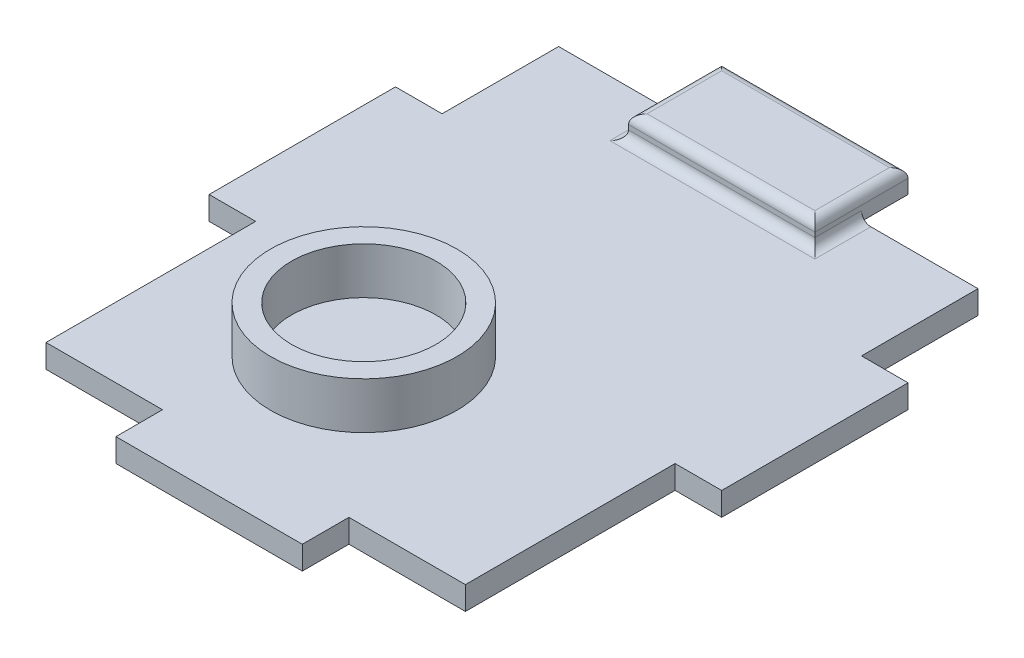
ISO-10303-21;
HEADER;
FILE_DESCRIPTION(('STEP AP214'),'2;1');
FILE_NAME('part.step','',(''),(''),'','','');
FILE_SCHEMA(('AUTOMOTIVE_DESIGN { 1 0 10303 214 1 1 1 1 }'));
ENDSEC;
DATA;
#1=APPLICATION_CONTEXT('core data for automotive mechanical design processes');
#2=APPLICATION_PROTOCOL_DEFINITION('international standard','automotive_design',2000,#1);
#3=PRODUCT_CONTEXT('',#1,'mechanical');
#4=PRODUCT('Part','Part','',(#3));
#5=PRODUCT_RELATED_PRODUCT_CATEGORY('part','',(#4));
#6=PRODUCT_DEFINITION_FORMATION('','',#4);
#7=PRODUCT_DEFINITION_CONTEXT('part definition',#1,'design');
#8=PRODUCT_DEFINITION('design','',#6,#7);
#9=PRODUCT_DEFINITION_SHAPE('','',#8);
#10=(LENGTH_UNIT() NAMED_UNIT(*) SI_UNIT(.MILLI.,.METRE.));
#11=(NAMED_UNIT(*) PLANE_ANGLE_UNIT() SI_UNIT($,.RADIAN.));
#12=(NAMED_UNIT(*) SI_UNIT($,.STERADIAN.) SOLID_ANGLE_UNIT());
#13=UNCERTAINTY_MEASURE_WITH_UNIT(LENGTH_MEASURE(1.E-05),#10,'distance_accuracy_value','');
#14=(GEOMETRIC_REPRESENTATION_CONTEXT(3) GLOBAL_UNCERTAINTY_ASSIGNED_CONTEXT((#13)) GLOBAL_UNIT_ASSIGNED_CONTEXT((#10,
#11,#12)) REPRESENTATION_CONTEXT('',''));
#15=CARTESIAN_POINT('',(0.,0.,0.));
#16=DIRECTION('',(0.,0.,1.));
#17=DIRECTION('',(1.,0.,0.));
#18=AXIS2_PLACEMENT_3D('',#15,#16,#17);
#19=CARTESIAN_POINT('',(0.,5.,0.));
#20=DIRECTION('',(0.,1.,0.));
#21=DIRECTION('',(0.,0.,1.));
#22=AXIS2_PLACEMENT_3D('',#19,#20,#21);
#23=PLANE('',#22);
#24=CARTESIAN_POINT('',(36.72,5.,-31.47));
#25=DIRECTION('',(0.,1.,0.));
#26=DIRECTION('',(0.,0.,1.));
#27=AXIS2_PLACEMENT_3D('',#24,#25,#26);
#28=CIRCLE('',#27,20.);
#29=CARTESIAN_POINT('',(36.72,5.,-11.47));
#30=VERTEX_POINT('',#29);
#31=EDGE_CURVE('E244',#30,#30,#28,.T.);
#32=ORIENTED_EDGE('',*,*,#31,.F.);
#33=EDGE_LOOP('',(#32));
#34=FACE_BOUND('',#33,.T.);
#35=DIRECTION('',(1.,0.,0.));
#36=VECTOR('',#35,1.);
#37=CARTESIAN_POINT('',(0.,5.,-98.));
#38=LINE('',#37,#36);
#39=CARTESIAN_POINT('',(67.,5.,-98.));
#40=VERTEX_POINT('',#39);
#41=CARTESIAN_POINT('',(23.,5.,-98.));
#42=VERTEX_POINT('',#41);
#43=EDGE_CURVE('E60',#40,#42,#38,.F.);
#44=ORIENTED_EDGE('',*,*,#43,.T.);
#45=DIRECTION('',(0.,0.,-1.));
#46=VECTOR('',#45,1.);
#47=CARTESIAN_POINT('',(23.,5.,0.));
#48=LINE('',#47,#46);
#49=CARTESIAN_POINT('',(23.,5.,-110.));
#50=VERTEX_POINT('',#49);
#51=EDGE_CURVE('E398',#42,#50,#48,.T.);
#52=ORIENTED_EDGE('',*,*,#51,.T.);
#53=DIRECTION('',(1.,0.,0.));
#54=VECTOR('',#53,1.);
#55=CARTESIAN_POINT('',(0.,5.,-110.));
#56=LINE('',#55,#54);
#57=CARTESIAN_POINT('',(0.,5.,-110.));
#58=VERTEX_POINT('',#57);
#59=EDGE_CURVE('E278',#58,#50,#56,.T.);
#60=ORIENTED_EDGE('',*,*,#59,.F.);
#61=DIRECTION('',(0.,0.,-1.));
#62=VECTOR('',#61,1.);
#63=CARTESIAN_POINT('',(0.,5.,0.));
#64=LINE('',#63,#62);
#65=CARTESIAN_POINT('',(0.,5.,-85.));
#66=VERTEX_POINT('',#65);
#67=EDGE_CURVE('E281',#66,#58,#64,.T.);
#68=ORIENTED_EDGE('',*,*,#67,.F.);
#69=DIRECTION('',(-1.,0.,0.));
#70=VECTOR('',#69,1.);
#71=CARTESIAN_POINT('',(1.17961196366423E-13,5.,-85.));
#72=LINE('',#71,#70);
#73=CARTESIAN_POINT('',(-9.99999999999999,5.,-85.));
#74=VERTEX_POINT('',#73);
#75=EDGE_CURVE('E286',#66,#74,#72,.T.);
#76=ORIENTED_EDGE('',*,*,#75,.T.);
#77=DIRECTION('',(0.,0.,1.));
#78=VECTOR('',#77,1.);
#79=CARTESIAN_POINT('',(-9.99999999999999,5.,0.));
#80=LINE('',#79,#78);
#81=CARTESIAN_POINT('',(-9.99999999999999,5.,-45.));
#82=VERTEX_POINT('',#81);
#83=EDGE_CURVE('E289',#74,#82,#80,.T.);
#84=ORIENTED_EDGE('',*,*,#83,.T.);
#85=DIRECTION('',(-1.,0.,0.));
#86=VECTOR('',#85,1.);
#87=CARTESIAN_POINT('',(0.,5.,-45.));
#88=LINE('',#87,#86);
#89=CARTESIAN_POINT('',(0.,5.,-45.));
#90=VERTEX_POINT('',#89);
#91=EDGE_CURVE('E291',#90,#82,#88,.T.);
#92=ORIENTED_EDGE('',*,*,#91,.F.);
#93=CARTESIAN_POINT('',(0.,5.,0.));
#94=VERTEX_POINT('',#93);
#95=EDGE_CURVE('E287',#94,#90,#64,.T.);
#96=ORIENTED_EDGE('',*,*,#95,.F.);
#97=DIRECTION('',(1.,0.,0.));
#98=VECTOR('',#97,1.);
#99=CARTESIAN_POINT('',(0.,5.,0.));
#100=LINE('',#99,#98);
#101=CARTESIAN_POINT('',(25.,5.,0.));
#102=VERTEX_POINT('',#101);
#103=EDGE_CURVE('E254',#94,#102,#100,.T.);
#104=ORIENTED_EDGE('',*,*,#103,.T.);
#105=DIRECTION('',(0.,0.,1.));
#106=VECTOR('',#105,1.);
#107=CARTESIAN_POINT('',(25.,5.,0.));
#108=LINE('',#107,#106);
#109=CARTESIAN_POINT('',(25.,5.,10.));
#110=VERTEX_POINT('',#109);
#111=EDGE_CURVE('E257',#102,#110,#108,.T.);
#112=ORIENTED_EDGE('',*,*,#111,.T.);
#113=DIRECTION('',(-1.,0.,0.));
#114=VECTOR('',#113,1.);
#115=CARTESIAN_POINT('',(0.,5.,10.));
#116=LINE('',#115,#114);
#117=CARTESIAN_POINT('',(65.,5.,10.));
#118=VERTEX_POINT('',#117);
#119=EDGE_CURVE('E261',#118,#110,#116,.T.);
#120=ORIENTED_EDGE('',*,*,#119,.F.);
#121=DIRECTION('',(0.,0.,1.));
#122=VECTOR('',#121,1.);
#123=CARTESIAN_POINT('',(65.,5.,0.));
#124=LINE('',#123,#122);
#125=CARTESIAN_POINT('',(65.,5.,0.));
#126=VERTEX_POINT('',#125);
#127=EDGE_CURVE('E264',#126,#118,#124,.T.);
#128=ORIENTED_EDGE('',*,*,#127,.F.);
#129=CARTESIAN_POINT('',(90.,5.,0.));
#130=VERTEX_POINT('',#129);
#131=EDGE_CURVE('E259',#126,#130,#100,.T.);
#132=ORIENTED_EDGE('',*,*,#131,.T.);
#133=DIRECTION('',(0.,0.,-1.));
#134=VECTOR('',#133,1.);
#135=CARTESIAN_POINT('',(90.,5.,0.));
#136=LINE('',#135,#134);
#137=CARTESIAN_POINT('',(90.,5.,-45.));
#138=VERTEX_POINT('',#137);
#139=EDGE_CURVE('E267',#130,#138,#136,.T.);
#140=ORIENTED_EDGE('',*,*,#139,.T.);
#141=DIRECTION('',(1.,0.,0.));
#142=VECTOR('',#141,1.);
#143=CARTESIAN_POINT('',(0.,5.,-45.));
#144=LINE('',#143,#142);
#145=CARTESIAN_POINT('',(100.,5.,-45.));
#146=VERTEX_POINT('',#145);
#147=EDGE_CURVE('E269',#138,#146,#144,.T.);
#148=ORIENTED_EDGE('',*,*,#147,.T.);
#149=DIRECTION('',(0.,0.,1.));
#150=VECTOR('',#149,1.);
#151=CARTESIAN_POINT('',(100.,5.,0.));
#152=LINE('',#151,#150);
#153=CARTESIAN_POINT('',(100.,5.,-85.));
#154=VERTEX_POINT('',#153);
#155=EDGE_CURVE('E272',#154,#146,#152,.T.);
#156=ORIENTED_EDGE('',*,*,#155,.F.);
#157=DIRECTION('',(1.,0.,0.));
#158=VECTOR('',#157,1.);
#159=CARTESIAN_POINT('',(1.17961196366423E-13,5.,-85.0000000000001));
#160=LINE('',#159,#158);
#161=CARTESIAN_POINT('',(90.,5.,-85.));
#162=VERTEX_POINT('',#161);
#163=EDGE_CURVE('E275',#162,#154,#160,.T.);
#164=ORIENTED_EDGE('',*,*,#163,.F.);
#165=CARTESIAN_POINT('',(90.,5.,-110.));
#166=VERTEX_POINT('',#165);
#167=EDGE_CURVE('E270',#162,#166,#136,.T.);
#168=ORIENTED_EDGE('',*,*,#167,.T.);
#169=CARTESIAN_POINT('',(67.,5.,-110.));
#170=VERTEX_POINT('',#169);
#171=EDGE_CURVE('E283',#170,#166,#56,.T.);
#172=ORIENTED_EDGE('',*,*,#171,.F.);
#173=DIRECTION('',(0.,0.,-1.));
#174=VECTOR('',#173,1.);
#175=CARTESIAN_POINT('',(66.9999999999999,5.,0.));
#176=LINE('',#175,#174);
#177=EDGE_CURVE('E396',#170,#40,#176,.F.);
#178=ORIENTED_EDGE('',*,*,#177,.T.);
#179=EDGE_LOOP('',(#44,#52,#60,#68,#76,#84,#92,#96,#104,#112,#120,#128,#132,#140,#148,#156,#164,
#168,#172,#178));
#180=FACE_BOUND('',#179,.T.);
#181=ADVANCED_FACE('F35',(#34,#180),#23,.T.);
#182=CARTESIAN_POINT('',(0.,5.,0.));
#183=DIRECTION('',(0.,0.,-1.));
#184=DIRECTION('',(-1.,0.,0.));
#185=AXIS2_PLACEMENT_3D('',#182,#183,#184);
#186=PLANE('',#185);
#187=DIRECTION('',(1.,0.,0.));
#188=VECTOR('',#187,1.);
#189=CARTESIAN_POINT('',(0.,0.,0.));
#190=LINE('',#189,#188);
#191=CARTESIAN_POINT('',(0.,0.,0.));
#192=VERTEX_POINT('',#191);
#193=CARTESIAN_POINT('',(25.,0.,0.));
#194=VERTEX_POINT('',#193);
#195=EDGE_CURVE('E251',#192,#194,#190,.T.);
#196=ORIENTED_EDGE('',*,*,#195,.T.);
#197=DIRECTION('',(0.,-1.,0.));
#198=VECTOR('',#197,1.);
#199=CARTESIAN_POINT('',(25.,5.,0.));
#200=LINE('',#199,#198);
#201=EDGE_CURVE('E365',#102,#194,#200,.T.);
#202=ORIENTED_EDGE('',*,*,#201,.F.);
#203=ORIENTED_EDGE('',*,*,#103,.F.);
#204=DIRECTION('',(0.,-1.,0.));
#205=VECTOR('',#204,1.);
#206=CARTESIAN_POINT('',(0.,5.,0.));
#207=LINE('',#206,#205);
#208=EDGE_CURVE('E332',#94,#192,#207,.T.);
#209=ORIENTED_EDGE('',*,*,#208,.T.);
#210=EDGE_LOOP('',(#196,#202,#203,#209));
#211=FACE_BOUND('',#210,.T.);
#212=ADVANCED_FACE('F460',(#211),#186,.F.);
#213=CARTESIAN_POINT('',(25.,5.,0.));
#214=DIRECTION('',(1.,0.,0.));
#215=DIRECTION('',(0.,0.,-1.));
#216=AXIS2_PLACEMENT_3D('',#213,#214,#215);
#217=PLANE('',#216);
#218=DIRECTION('',(0.,0.,1.));
#219=VECTOR('',#218,1.);
#220=CARTESIAN_POINT('',(25.,0.,0.));
#221=LINE('',#220,#219);
#222=CARTESIAN_POINT('',(25.,0.,10.));
#223=VERTEX_POINT('',#222);
#224=EDGE_CURVE('E296',#194,#223,#221,.T.);
#225=ORIENTED_EDGE('',*,*,#224,.T.);
#226=DIRECTION('',(0.,-1.,0.));
#227=VECTOR('',#226,1.);
#228=CARTESIAN_POINT('',(25.,5.,10.));
#229=LINE('',#228,#227);
#230=EDGE_CURVE('E363',#110,#223,#229,.T.);
#231=ORIENTED_EDGE('',*,*,#230,.F.);
#232=ORIENTED_EDGE('',*,*,#111,.F.);
#233=ORIENTED_EDGE('',*,*,#201,.T.);
#234=EDGE_LOOP('',(#225,#231,#232,#233));
#235=FACE_BOUND('',#234,.T.);
#236=ADVANCED_FACE('F467',(#235),#217,.F.);
#237=CARTESIAN_POINT('',(0.,5.,10.));
#238=DIRECTION('',(0.,0.,1.));
#239=DIRECTION('',(1.,0.,0.));
#240=AXIS2_PLACEMENT_3D('',#237,#238,#239);
#241=PLANE('',#240);
#242=DIRECTION('',(-1.,0.,0.));
#243=VECTOR('',#242,1.);
#244=CARTESIAN_POINT('',(0.,0.,10.));
#245=LINE('',#244,#243);
#246=CARTESIAN_POINT('',(65.,0.,10.));
#247=VERTEX_POINT('',#246);
#248=EDGE_CURVE('E300',#247,#223,#245,.T.);
#249=ORIENTED_EDGE('',*,*,#248,.F.);
#250=DIRECTION('',(0.,-1.,0.));
#251=VECTOR('',#250,1.);
#252=CARTESIAN_POINT('',(65.,5.,10.));
#253=LINE('',#252,#251);
#254=EDGE_CURVE('E361',#118,#247,#253,.T.);
#255=ORIENTED_EDGE('',*,*,#254,.F.);
#256=ORIENTED_EDGE('',*,*,#119,.T.);
#257=ORIENTED_EDGE('',*,*,#230,.T.);
#258=EDGE_LOOP('',(#249,#255,#256,#257));
#259=FACE_BOUND('',#258,.T.);
#260=ADVANCED_FACE('F737',(#259),#241,.T.);
#261=CARTESIAN_POINT('',(65.,5.,0.));
#262=DIRECTION('',(1.,0.,0.));
#263=DIRECTION('',(0.,0.,-1.));
#264=AXIS2_PLACEMENT_3D('',#261,#262,#263);
#265=PLANE('',#264);
#266=DIRECTION('',(0.,0.,1.));
#267=VECTOR('',#266,1.);
#268=CARTESIAN_POINT('',(65.,0.,0.));
#269=LINE('',#268,#267);
#270=CARTESIAN_POINT('',(65.,0.,0.));
#271=VERTEX_POINT('',#270);
#272=EDGE_CURVE('E303',#271,#247,#269,.T.);
#273=ORIENTED_EDGE('',*,*,#272,.F.);
#274=DIRECTION('',(0.,-1.,0.));
#275=VECTOR('',#274,1.);
#276=CARTESIAN_POINT('',(65.,5.,0.));
#277=LINE('',#276,#275);
#278=EDGE_CURVE('E359',#126,#271,#277,.T.);
#279=ORIENTED_EDGE('',*,*,#278,.F.);
#280=ORIENTED_EDGE('',*,*,#127,.T.);
#281=ORIENTED_EDGE('',*,*,#254,.T.);
#282=EDGE_LOOP('',(#273,#279,#280,#281));
#283=FACE_BOUND('',#282,.T.);
#284=ADVANCED_FACE('F733',(#283),#265,.T.);
#285=CARTESIAN_POINT('',(90.,0.,0.));
#286=VERTEX_POINT('',#285);
#287=EDGE_CURVE('E297',#271,#286,#190,.T.);
#288=ORIENTED_EDGE('',*,*,#287,.T.);
#289=DIRECTION('',(0.,-1.,0.));
#290=VECTOR('',#289,1.);
#291=CARTESIAN_POINT('',(90.,5.,0.));
#292=LINE('',#291,#290);
#293=EDGE_CURVE('E356',#130,#286,#292,.T.);
#294=ORIENTED_EDGE('',*,*,#293,.F.);
#295=ORIENTED_EDGE('',*,*,#131,.F.);
#296=ORIENTED_EDGE('',*,*,#278,.T.);
#297=EDGE_LOOP('',(#288,#294,#295,#296));
#298=FACE_BOUND('',#297,.T.);
#299=ADVANCED_FACE('F470',(#298),#186,.F.);
#300=CARTESIAN_POINT('',(90.,5.,0.));
#301=DIRECTION('',(-1.,0.,0.));
#302=DIRECTION('',(0.,0.,1.));
#303=AXIS2_PLACEMENT_3D('',#300,#301,#302);
#304=PLANE('',#303);
#305=DIRECTION('',(0.,0.,-1.));
#306=VECTOR('',#305,1.);
#307=CARTESIAN_POINT('',(90.,0.,0.));
#308=LINE('',#307,#306);
#309=CARTESIAN_POINT('',(90.,0.,-45.));
#310=VERTEX_POINT('',#309);
#311=EDGE_CURVE('E306',#286,#310,#308,.T.);
#312=ORIENTED_EDGE('',*,*,#311,.T.);
#313=DIRECTION('',(0.,-1.,0.));
#314=VECTOR('',#313,1.);
#315=CARTESIAN_POINT('',(90.,5.,-45.));
#316=LINE('',#315,#314);
#317=EDGE_CURVE('E353',#138,#310,#316,.T.);
#318=ORIENTED_EDGE('',*,*,#317,.F.);
#319=ORIENTED_EDGE('',*,*,#139,.F.);
#320=ORIENTED_EDGE('',*,*,#293,.T.);
#321=EDGE_LOOP('',(#312,#318,#319,#320));
#322=FACE_BOUND('',#321,.T.);
#323=ADVANCED_FACE('F721',(#322),#304,.F.);
#324=CARTESIAN_POINT('',(0.,5.,-45.));
#325=DIRECTION('',(0.,0.,-1.));
#326=DIRECTION('',(-1.,0.,0.));
#327=AXIS2_PLACEMENT_3D('',#324,#325,#326);
#328=PLANE('',#327);
#329=DIRECTION('',(1.,0.,0.));
#330=VECTOR('',#329,1.);
#331=CARTESIAN_POINT('',(0.,0.,-45.));
#332=LINE('',#331,#330);
#333=CARTESIAN_POINT('',(100.,0.,-45.));
#334=VERTEX_POINT('',#333);
#335=EDGE_CURVE('E308',#310,#334,#332,.T.);
#336=ORIENTED_EDGE('',*,*,#335,.T.);
#337=DIRECTION('',(0.,-1.,0.));
#338=VECTOR('',#337,1.);
#339=CARTESIAN_POINT('',(100.,5.,-45.));
#340=LINE('',#339,#338);
#341=EDGE_CURVE('E351',#146,#334,#340,.T.);
#342=ORIENTED_EDGE('',*,*,#341,.F.);
#343=ORIENTED_EDGE('',*,*,#147,.F.);
#344=ORIENTED_EDGE('',*,*,#317,.T.);
#345=EDGE_LOOP('',(#336,#342,#343,#344));
#346=FACE_BOUND('',#345,.T.);
#347=ADVANCED_FACE('F727',(#346),#328,.F.);
#348=CARTESIAN_POINT('',(100.,5.,0.));
#349=DIRECTION('',(1.,0.,0.));
#350=DIRECTION('',(0.,0.,-1.));
#351=AXIS2_PLACEMENT_3D('',#348,#349,#350);
#352=PLANE('',#351);
#353=DIRECTION('',(0.,0.,1.));
#354=VECTOR('',#353,1.);
#355=CARTESIAN_POINT('',(100.,0.,0.));
#356=LINE('',#355,#354);
#357=CARTESIAN_POINT('',(100.,0.,-85.));
#358=VERTEX_POINT('',#357);
#359=EDGE_CURVE('E312',#358,#334,#356,.T.);
#360=ORIENTED_EDGE('',*,*,#359,.F.);
#361=DIRECTION('',(0.,-1.,0.));
#362=VECTOR('',#361,1.);
#363=CARTESIAN_POINT('',(100.,5.,-85.));
#364=LINE('',#363,#362);
#365=EDGE_CURVE('E349',#154,#358,#364,.T.);
#366=ORIENTED_EDGE('',*,*,#365,.F.);
#367=ORIENTED_EDGE('',*,*,#155,.T.);
#368=ORIENTED_EDGE('',*,*,#341,.T.);
#369=EDGE_LOOP('',(#360,#366,#367,#368));
#370=FACE_BOUND('',#369,.T.);
#371=ADVANCED_FACE('F723',(#370),#352,.T.);
#372=CARTESIAN_POINT('',(1.17961196366423E-13,5.,-85.0000000000001));
#373=DIRECTION('',(0.,0.,-1.));
#374=DIRECTION('',(-1.,0.,0.));
#375=AXIS2_PLACEMENT_3D('',#372,#373,#374);
#376=PLANE('',#375);
#377=DIRECTION('',(1.,0.,0.));
#378=VECTOR('',#377,1.);
#379=CARTESIAN_POINT('',(1.17961196366423E-13,0.,-85.0000000000001));
#380=LINE('',#379,#378);
#381=CARTESIAN_POINT('',(90.,0.,-85.));
#382=VERTEX_POINT('',#381);
#383=EDGE_CURVE('E315',#382,#358,#380,.T.);
#384=ORIENTED_EDGE('',*,*,#383,.F.);
#385=DIRECTION('',(0.,-1.,0.));
#386=VECTOR('',#385,1.);
#387=CARTESIAN_POINT('',(90.,5.,-85.));
#388=LINE('',#387,#386);
#389=EDGE_CURVE('E347',#162,#382,#388,.T.);
#390=ORIENTED_EDGE('',*,*,#389,.F.);
#391=ORIENTED_EDGE('',*,*,#163,.T.);
#392=ORIENTED_EDGE('',*,*,#365,.T.);
#393=EDGE_LOOP('',(#384,#390,#391,#392));
#394=FACE_BOUND('',#393,.T.);
#395=ADVANCED_FACE('F719',(#394),#376,.T.);
#396=CARTESIAN_POINT('',(90.,0.,-110.));
#397=VERTEX_POINT('',#396);
#398=EDGE_CURVE('E309',#382,#397,#308,.T.);
#399=ORIENTED_EDGE('',*,*,#398,.T.);
#400=DIRECTION('',(0.,-1.,0.));
#401=VECTOR('',#400,1.);
#402=CARTESIAN_POINT('',(90.,5.,-110.));
#403=LINE('',#402,#401);
#404=EDGE_CURVE('E345',#166,#397,#403,.T.);
#405=ORIENTED_EDGE('',*,*,#404,.F.);
#406=ORIENTED_EDGE('',*,*,#167,.F.);
#407=ORIENTED_EDGE('',*,*,#389,.T.);
#408=EDGE_LOOP('',(#399,#405,#406,#407));
#409=FACE_BOUND('',#408,.T.);
#410=ADVANCED_FACE('F604',(#409),#304,.F.);
#411=CARTESIAN_POINT('',(0.,5.,-110.));
#412=DIRECTION('',(0.,0.,-1.));
#413=DIRECTION('',(-1.,0.,0.));
#414=AXIS2_PLACEMENT_3D('',#411,#412,#413);
#415=PLANE('',#414);
#416=DIRECTION('',(1.,0.,0.));
#417=VECTOR('',#416,1.);
#418=CARTESIAN_POINT('',(0.,0.,-110.));
#419=LINE('',#418,#417);
#420=CARTESIAN_POINT('',(0.,0.,-110.));
#421=VERTEX_POINT('',#420);
#422=EDGE_CURVE('E318',#421,#397,#419,.T.);
#423=ORIENTED_EDGE('',*,*,#422,.F.);
#424=DIRECTION('',(0.,-1.,0.));
#425=VECTOR('',#424,1.);
#426=CARTESIAN_POINT('',(0.,5.,-110.));
#427=LINE('',#426,#425);
#428=EDGE_CURVE('E343',#58,#421,#427,.T.);
#429=ORIENTED_EDGE('',*,*,#428,.F.);
#430=ORIENTED_EDGE('',*,*,#59,.T.);
#431=CARTESIAN_POINT('',(23.,7.,-110.));
#432=DIRECTION('',(0.,0.,-1.));
#433=DIRECTION('',(-1.,0.,0.));
#434=AXIS2_PLACEMENT_3D('',#431,#432,#433);
#435=CIRCLE('',#434,2.);
#436=CARTESIAN_POINT('',(25.,7.,-110.));
#437=VERTEX_POINT('',#436);
#438=EDGE_CURVE('E44',#50,#437,#435,.F.);
#439=ORIENTED_EDGE('',*,*,#438,.T.);
#440=DIRECTION('',(0.,1.,0.));
#441=VECTOR('',#440,1.);
#442=CARTESIAN_POINT('',(25.,10.,-110.));
#443=LINE('',#442,#441);
#444=CARTESIAN_POINT('',(25.,5.,-110.));
#445=VERTEX_POINT('',#444);
#446=EDGE_CURVE('E52',#445,#437,#443,.T.);
#447=ORIENTED_EDGE('',*,*,#446,.F.);
#448=CARTESIAN_POINT('',(65.,5.,-110.));
#449=VERTEX_POINT('',#448);
#450=EDGE_CURVE('E282',#445,#449,#56,.T.);
#451=ORIENTED_EDGE('',*,*,#450,.T.);
#452=DIRECTION('',(0.,-1.,0.));
#453=VECTOR('',#452,1.);
#454=CARTESIAN_POINT('',(65.,10.,-110.));
#455=LINE('',#454,#453);
#456=CARTESIAN_POINT('',(65.,7.,-110.));
#457=VERTEX_POINT('',#456);
#458=EDGE_CURVE('E229',#457,#449,#455,.T.);
#459=ORIENTED_EDGE('',*,*,#458,.F.);
#460=CARTESIAN_POINT('',(67.,7.,-110.));
#461=DIRECTION('',(0.,0.,-1.));
#462=DIRECTION('',(-1.,0.,0.));
#463=AXIS2_PLACEMENT_3D('',#460,#461,#462);
#464=CIRCLE('',#463,2.);
#465=EDGE_CURVE('E11',#457,#170,#464,.F.);
#466=ORIENTED_EDGE('',*,*,#465,.T.);
#467=ORIENTED_EDGE('',*,*,#171,.T.);
#468=ORIENTED_EDGE('',*,*,#404,.T.);
#469=EDGE_LOOP('',(#423,#429,#430,#439,#447,#451,#459,#466,#467,#468));
#470=FACE_BOUND('',#469,.T.);
#471=ADVANCED_FACE('F599',(#470),#415,.T.);
#472=CARTESIAN_POINT('',(0.,5.,0.));
#473=DIRECTION('',(-1.,0.,0.));
#474=DIRECTION('',(0.,0.,1.));
#475=AXIS2_PLACEMENT_3D('',#472,#473,#474);
#476=PLANE('',#475);
#477=DIRECTION('',(0.,0.,-1.));
#478=VECTOR('',#477,1.);
#479=CARTESIAN_POINT('',(0.,0.,0.));
#480=LINE('',#479,#478);
#481=CARTESIAN_POINT('',(0.,0.,-85.));
#482=VERTEX_POINT('',#481);
#483=EDGE_CURVE('E321',#482,#421,#480,.T.);
#484=ORIENTED_EDGE('',*,*,#483,.F.);
#485=DIRECTION('',(0.,-1.,0.));
#486=VECTOR('',#485,1.);
#487=CARTESIAN_POINT('',(0.,5.,-85.));
#488=LINE('',#487,#486);
#489=EDGE_CURVE('E341',#66,#482,#488,.T.);
#490=ORIENTED_EDGE('',*,*,#489,.F.);
#491=ORIENTED_EDGE('',*,*,#67,.T.);
#492=ORIENTED_EDGE('',*,*,#428,.T.);
#493=EDGE_LOOP('',(#484,#490,#491,#492));
#494=FACE_BOUND('',#493,.T.);
#495=ADVANCED_FACE('F603',(#494),#476,.T.);
#496=CARTESIAN_POINT('',(1.17961196366423E-13,5.,-85.));
#497=DIRECTION('',(0.,0.,1.));
#498=DIRECTION('',(1.,0.,0.));
#499=AXIS2_PLACEMENT_3D('',#496,#497,#498);
#500=PLANE('',#499);
#501=DIRECTION('',(-1.,0.,0.));
#502=VECTOR('',#501,1.);
#503=CARTESIAN_POINT('',(1.17961196366423E-13,0.,-85.));
#504=LINE('',#503,#502);
#505=CARTESIAN_POINT('',(-9.99999999999999,0.,-85.));
#506=VERTEX_POINT('',#505);
#507=EDGE_CURVE('E324',#482,#506,#504,.T.);
#508=ORIENTED_EDGE('',*,*,#507,.T.);
#509=DIRECTION('',(0.,-1.,0.));
#510=VECTOR('',#509,1.);
#511=CARTESIAN_POINT('',(-9.99999999999999,5.,-85.));
#512=LINE('',#511,#510);
#513=EDGE_CURVE('E338',#74,#506,#512,.T.);
#514=ORIENTED_EDGE('',*,*,#513,.F.);
#515=ORIENTED_EDGE('',*,*,#75,.F.);
#516=ORIENTED_EDGE('',*,*,#489,.T.);
#517=EDGE_LOOP('',(#508,#514,#515,#516));
#518=FACE_BOUND('',#517,.T.);
#519=ADVANCED_FACE('F619',(#518),#500,.F.);
#520=CARTESIAN_POINT('',(-9.99999999999999,5.,0.));
#521=DIRECTION('',(1.,0.,0.));
#522=DIRECTION('',(0.,0.,-1.));
#523=AXIS2_PLACEMENT_3D('',#520,#521,#522);
#524=PLANE('',#523);
#525=DIRECTION('',(0.,0.,1.));
#526=VECTOR('',#525,1.);
#527=CARTESIAN_POINT('',(-9.99999999999999,0.,0.));
#528=LINE('',#527,#526);
#529=CARTESIAN_POINT('',(-9.99999999999999,0.,-45.));
#530=VERTEX_POINT('',#529);
#531=EDGE_CURVE('E326',#506,#530,#528,.T.);
#532=ORIENTED_EDGE('',*,*,#531,.T.);
#533=DIRECTION('',(0.,-1.,0.));
#534=VECTOR('',#533,1.);
#535=CARTESIAN_POINT('',(-9.99999999999999,5.,-45.));
#536=LINE('',#535,#534);
#537=EDGE_CURVE('E336',#82,#530,#536,.T.);
#538=ORIENTED_EDGE('',*,*,#537,.F.);
#539=ORIENTED_EDGE('',*,*,#83,.F.);
#540=ORIENTED_EDGE('',*,*,#513,.T.);
#541=EDGE_LOOP('',(#532,#538,#539,#540));
#542=FACE_BOUND('',#541,.T.);
#543=ADVANCED_FACE('F627',(#542),#524,.F.);
#544=CARTESIAN_POINT('',(0.,5.,-45.));
#545=DIRECTION('',(0.,0.,1.));
#546=DIRECTION('',(1.,0.,0.));
#547=AXIS2_PLACEMENT_3D('',#544,#545,#546);
#548=PLANE('',#547);
#549=DIRECTION('',(-1.,0.,0.));
#550=VECTOR('',#549,1.);
#551=CARTESIAN_POINT('',(0.,0.,-45.));
#552=LINE('',#551,#550);
#553=CARTESIAN_POINT('',(0.,0.,-45.));
#554=VERTEX_POINT('',#553);
#555=EDGE_CURVE('E329',#554,#530,#552,.T.);
#556=ORIENTED_EDGE('',*,*,#555,.F.);
#557=DIRECTION('',(0.,-1.,0.));
#558=VECTOR('',#557,1.);
#559=CARTESIAN_POINT('',(0.,5.,-45.));
#560=LINE('',#559,#558);
#561=EDGE_CURVE('E334',#90,#554,#560,.T.);
#562=ORIENTED_EDGE('',*,*,#561,.F.);
#563=ORIENTED_EDGE('',*,*,#91,.T.);
#564=ORIENTED_EDGE('',*,*,#537,.T.);
#565=EDGE_LOOP('',(#556,#562,#563,#564));
#566=FACE_BOUND('',#565,.T.);
#567=ADVANCED_FACE('F635',(#566),#548,.T.);
#568=EDGE_CURVE('E258',#192,#554,#480,.T.);
#569=ORIENTED_EDGE('',*,*,#568,.F.);
#570=ORIENTED_EDGE('',*,*,#208,.F.);
#571=ORIENTED_EDGE('',*,*,#95,.T.);
#572=ORIENTED_EDGE('',*,*,#561,.T.);
#573=EDGE_LOOP('',(#569,#570,#571,#572));
#574=FACE_BOUND('',#573,.T.);
#575=ADVANCED_FACE('F497',(#574),#476,.T.);
#576=CARTESIAN_POINT('',(0.,0.,0.));
#577=DIRECTION('',(0.,1.,0.));
#578=DIRECTION('',(0.,0.,1.));
#579=AXIS2_PLACEMENT_3D('',#576,#577,#578);
#580=PLANE('',#579);
#581=ORIENTED_EDGE('',*,*,#195,.F.);
#582=ORIENTED_EDGE('',*,*,#568,.T.);
#583=ORIENTED_EDGE('',*,*,#555,.T.);
#584=ORIENTED_EDGE('',*,*,#531,.F.);
#585=ORIENTED_EDGE('',*,*,#507,.F.);
#586=ORIENTED_EDGE('',*,*,#483,.T.);
#587=ORIENTED_EDGE('',*,*,#422,.T.);
#588=ORIENTED_EDGE('',*,*,#398,.F.);
#589=ORIENTED_EDGE('',*,*,#383,.T.);
#590=ORIENTED_EDGE('',*,*,#359,.T.);
#591=ORIENTED_EDGE('',*,*,#335,.F.);
#592=ORIENTED_EDGE('',*,*,#311,.F.);
#593=ORIENTED_EDGE('',*,*,#287,.F.);
#594=ORIENTED_EDGE('',*,*,#272,.T.);
#595=ORIENTED_EDGE('',*,*,#248,.T.);
#596=ORIENTED_EDGE('',*,*,#224,.F.);
#597=EDGE_LOOP('',(#581,#582,#583,#584,#585,#586,#587,#588,#589,#590,#591,#592,#593,#594,#595,#596));
#598=FACE_BOUND('',#597,.T.);
#599=ADVANCED_FACE('F489',(#598),#580,.F.);
#600=CARTESIAN_POINT('',(36.72,15.,-31.47));
#601=DIRECTION('',(0.,-1.,0.));
#602=DIRECTION('',(0.,0.,-1.));
#603=AXIS2_PLACEMENT_3D('',#600,#601,#602);
#604=CYLINDRICAL_SURFACE('',#603,15.5);
#605=CARTESIAN_POINT('',(36.72,15.,-31.47));
#606=DIRECTION('',(0.,1.,0.));
#607=DIRECTION('',(0.,0.,1.));
#608=AXIS2_PLACEMENT_3D('',#605,#606,#607);
#609=CIRCLE('',#608,15.5);
#610=CARTESIAN_POINT('',(36.72,15.,-15.97));
#611=VERTEX_POINT('',#610);
#612=EDGE_CURVE('E245',#611,#611,#609,.T.);
#613=ORIENTED_EDGE('',*,*,#612,.T.);
#614=EDGE_LOOP('',(#613));
#615=FACE_BOUND('',#614,.T.);
#616=CARTESIAN_POINT('',(36.72,5.,-31.47));
#617=DIRECTION('',(0.,1.,0.));
#618=DIRECTION('',(0.,0.,1.));
#619=AXIS2_PLACEMENT_3D('',#616,#617,#618);
#620=CIRCLE('',#619,15.5);
#621=CARTESIAN_POINT('',(36.72,5.,-15.97));
#622=VERTEX_POINT('',#621);
#623=EDGE_CURVE('E368',#622,#622,#620,.F.);
#624=ORIENTED_EDGE('',*,*,#623,.T.);
#625=EDGE_LOOP('',(#624));
#626=FACE_BOUND('',#625,.T.);
#627=ADVANCED_FACE('F487',(#615,#626),#604,.F.);
#628=CARTESIAN_POINT('',(36.72,15.,-31.47));
#629=DIRECTION('',(0.,-1.,0.));
#630=DIRECTION('',(0.,0.,-1.));
#631=AXIS2_PLACEMENT_3D('',#628,#629,#630);
#632=CYLINDRICAL_SURFACE('',#631,20.);
#633=CARTESIAN_POINT('',(36.72,15.,-31.47));
#634=DIRECTION('',(0.,1.,0.));
#635=DIRECTION('',(0.,0.,1.));
#636=AXIS2_PLACEMENT_3D('',#633,#634,#635);
#637=CIRCLE('',#636,20.);
#638=CARTESIAN_POINT('',(36.72,15.,-11.47));
#639=VERTEX_POINT('',#638);
#640=EDGE_CURVE('E248',#639,#639,#637,.T.);
#641=ORIENTED_EDGE('',*,*,#640,.F.);
#642=EDGE_LOOP('',(#641));
#643=FACE_BOUND('',#642,.T.);
#644=ORIENTED_EDGE('',*,*,#31,.T.);
#645=EDGE_LOOP('',(#644));
#646=FACE_BOUND('',#645,.T.);
#647=ADVANCED_FACE('F482',(#643,#646),#632,.T.);
#648=CARTESIAN_POINT('',(0.,15.,0.));
#649=DIRECTION('',(0.,1.,0.));
#650=DIRECTION('',(0.,0.,1.));
#651=AXIS2_PLACEMENT_3D('',#648,#649,#650);
#652=PLANE('',#651);
#653=ORIENTED_EDGE('',*,*,#612,.F.);
#654=EDGE_LOOP('',(#653));
#655=FACE_BOUND('',#654,.T.);
#656=ORIENTED_EDGE('',*,*,#640,.T.);
#657=EDGE_LOOP('',(#656));
#658=FACE_BOUND('',#657,.T.);
#659=ADVANCED_FACE('F475',(#655,#658),#652,.T.);
#660=ORIENTED_EDGE('',*,*,#623,.F.);
#661=EDGE_LOOP('',(#660));
#662=FACE_BOUND('',#661,.T.);
#663=ADVANCED_FACE('F463',(#662),#23,.T.);
#664=CARTESIAN_POINT('',(25.,10.,-120.));
#665=DIRECTION('',(1.,0.,0.));
#666=DIRECTION('',(0.,0.,-1.));
#667=AXIS2_PLACEMENT_3D('',#664,#665,#666);
#668=PLANE('',#667);
#669=DIRECTION('',(0.,-1.,0.));
#670=VECTOR('',#669,1.);
#671=CARTESIAN_POINT('',(25.,10.,-100.));
#672=LINE('',#671,#670);
#673=CARTESIAN_POINT('',(25.,8.,-100.));
#674=VERTEX_POINT('',#673);
#675=CARTESIAN_POINT('',(25.,7.,-100.));
#676=VERTEX_POINT('',#675);
#677=EDGE_CURVE('E241',#674,#676,#672,.T.);
#678=ORIENTED_EDGE('',*,*,#677,.F.);
#679=DIRECTION('',(0.,0.,1.));
#680=VECTOR('',#679,1.);
#681=CARTESIAN_POINT('',(25.,8.,-120.));
#682=LINE('',#681,#680);
#683=CARTESIAN_POINT('',(25.,8.,-120.));
#684=VERTEX_POINT('',#683);
#685=EDGE_CURVE('E393',#674,#684,#682,.F.);
#686=ORIENTED_EDGE('',*,*,#685,.T.);
#687=DIRECTION('',(0.,-1.,0.));
#688=VECTOR('',#687,1.);
#689=CARTESIAN_POINT('',(25.,10.,-120.));
#690=LINE('',#689,#688);
#691=CARTESIAN_POINT('',(25.,5.,-120.));
#692=VERTEX_POINT('',#691);
#693=EDGE_CURVE('E223',#684,#692,#690,.T.);
#694=ORIENTED_EDGE('',*,*,#693,.T.);
#695=DIRECTION('',(0.,0.,1.));
#696=VECTOR('',#695,1.);
#697=CARTESIAN_POINT('',(25.,5.,-120.));
#698=LINE('',#697,#696);
#699=EDGE_CURVE('E232',#692,#445,#698,.T.);
#700=ORIENTED_EDGE('',*,*,#699,.T.);
#701=ORIENTED_EDGE('',*,*,#446,.T.);
#702=DIRECTION('',(0.,0.,-1.));
#703=VECTOR('',#702,1.);
#704=CARTESIAN_POINT('',(25.,7.,-120.));
#705=LINE('',#704,#703);
#706=EDGE_CURVE('E390',#437,#676,#705,.F.);
#707=ORIENTED_EDGE('',*,*,#706,.T.);
#708=EDGE_LOOP('',(#678,#686,#694,#700,#701,#707));
#709=FACE_BOUND('',#708,.T.);
#710=ADVANCED_FACE('F448',(#709),#668,.F.);
#711=CARTESIAN_POINT('',(65.,10.,-100.));
#712=DIRECTION('',(0.,0.,-1.));
#713=DIRECTION('',(-1.,0.,0.));
#714=AXIS2_PLACEMENT_3D('',#711,#712,#713);
#715=PLANE('',#714);
#716=DIRECTION('',(0.,-1.,0.));
#717=VECTOR('',#716,1.);
#718=CARTESIAN_POINT('',(65.,10.,-100.));
#719=LINE('',#718,#717);
#720=CARTESIAN_POINT('',(65.,8.,-100.));
#721=VERTEX_POINT('',#720);
#722=CARTESIAN_POINT('',(65.,7.,-100.));
#723=VERTEX_POINT('',#722);
#724=EDGE_CURVE('E222',#721,#723,#719,.T.);
#725=ORIENTED_EDGE('',*,*,#724,.F.);
#726=DIRECTION('',(1.,0.,0.));
#727=VECTOR('',#726,1.);
#728=CARTESIAN_POINT('',(65.,8.,-100.));
#729=LINE('',#728,#727);
#730=EDGE_CURVE('E388',#721,#674,#729,.F.);
#731=ORIENTED_EDGE('',*,*,#730,.T.);
#732=ORIENTED_EDGE('',*,*,#677,.T.);
#733=DIRECTION('',(1.,0.,0.));
#734=VECTOR('',#733,1.);
#735=CARTESIAN_POINT('',(65.,7.,-100.));
#736=LINE('',#735,#734);
#737=EDGE_CURVE('E386',#676,#723,#736,.T.);
#738=ORIENTED_EDGE('',*,*,#737,.T.);
#739=EDGE_LOOP('',(#725,#731,#732,#738));
#740=FACE_BOUND('',#739,.T.);
#741=ADVANCED_FACE('F428',(#740),#715,.F.);
#742=CARTESIAN_POINT('',(65.,10.,-120.));
#743=DIRECTION('',(-1.,0.,0.));
#744=DIRECTION('',(0.,0.,1.));
#745=AXIS2_PLACEMENT_3D('',#742,#743,#744);
#746=PLANE('',#745);
#747=DIRECTION('',(0.,-1.,0.));
#748=VECTOR('',#747,1.);
#749=CARTESIAN_POINT('',(65.,10.,-120.));
#750=LINE('',#749,#748);
#751=CARTESIAN_POINT('',(65.,8.,-120.));
#752=VERTEX_POINT('',#751);
#753=CARTESIAN_POINT('',(65.,5.,-120.));
#754=VERTEX_POINT('',#753);
#755=EDGE_CURVE('E212',#752,#754,#750,.T.);
#756=ORIENTED_EDGE('',*,*,#755,.F.);
#757=DIRECTION('',(0.,0.,-1.));
#758=VECTOR('',#757,1.);
#759=CARTESIAN_POINT('',(65.,8.,-120.));
#760=LINE('',#759,#758);
#761=EDGE_CURVE('E384',#752,#721,#760,.F.);
#762=ORIENTED_EDGE('',*,*,#761,.T.);
#763=ORIENTED_EDGE('',*,*,#724,.T.);
#764=DIRECTION('',(0.,0.,-1.));
#765=VECTOR('',#764,1.);
#766=CARTESIAN_POINT('',(65.,7.,-120.));
#767=LINE('',#766,#765);
#768=EDGE_CURVE('E382',#723,#457,#767,.T.);
#769=ORIENTED_EDGE('',*,*,#768,.T.);
#770=ORIENTED_EDGE('',*,*,#458,.T.);
#771=DIRECTION('',(0.,0.,-1.));
#772=VECTOR('',#771,1.);
#773=CARTESIAN_POINT('',(65.,5.,-120.));
#774=LINE('',#773,#772);
#775=EDGE_CURVE('E226',#449,#754,#774,.T.);
#776=ORIENTED_EDGE('',*,*,#775,.T.);
#777=EDGE_LOOP('',(#756,#762,#763,#769,#770,#776));
#778=FACE_BOUND('',#777,.T.);
#779=ADVANCED_FACE('F227',(#778),#746,.F.);
#780=CARTESIAN_POINT('',(65.,10.,-120.));
#781=DIRECTION('',(0.,0.,1.));
#782=DIRECTION('',(1.,0.,0.));
#783=AXIS2_PLACEMENT_3D('',#780,#781,#782);
#784=PLANE('',#783);
#785=ORIENTED_EDGE('',*,*,#693,.F.);
#786=DIRECTION('',(-1.,0.,0.));
#787=VECTOR('',#786,1.);
#788=CARTESIAN_POINT('',(65.,8.,-120.));
#789=LINE('',#788,#787);
#790=EDGE_CURVE('E220',#684,#752,#789,.F.);
#791=ORIENTED_EDGE('',*,*,#790,.T.);
#792=ORIENTED_EDGE('',*,*,#755,.T.);
#793=DIRECTION('',(-1.,0.,0.));
#794=VECTOR('',#793,1.);
#795=CARTESIAN_POINT('',(65.,5.,-120.));
#796=LINE('',#795,#794);
#797=EDGE_CURVE('E217',#754,#692,#796,.T.);
#798=ORIENTED_EDGE('',*,*,#797,.T.);
#799=EDGE_LOOP('',(#785,#791,#792,#798));
#800=FACE_BOUND('',#799,.T.);
#801=ADVANCED_FACE('F215',(#800),#784,.F.);
#802=CARTESIAN_POINT('',(0.,10.,0.));
#803=DIRECTION('',(0.,-1.,0.));
#804=DIRECTION('',(0.,0.,-1.));
#805=AXIS2_PLACEMENT_3D('',#802,#803,#804);
#806=PLANE('',#805);
#807=DIRECTION('',(0.,0.,-1.));
#808=VECTOR('',#807,1.);
#809=CARTESIAN_POINT('',(62.9999999999999,10.,0.));
#810=LINE('',#809,#808);
#811=CARTESIAN_POINT('',(63.,10.,-102.));
#812=VERTEX_POINT('',#811);
#813=CARTESIAN_POINT('',(63.,10.,-118.));
#814=VERTEX_POINT('',#813);
#815=EDGE_CURVE('E375',#812,#814,#810,.T.);
#816=ORIENTED_EDGE('',*,*,#815,.T.);
#817=DIRECTION('',(-1.,0.,0.));
#818=VECTOR('',#817,1.);
#819=CARTESIAN_POINT('',(0.,10.,-118.));
#820=LINE('',#819,#818);
#821=CARTESIAN_POINT('',(27.,10.,-118.));
#822=VERTEX_POINT('',#821);
#823=EDGE_CURVE('E377',#814,#822,#820,.T.);
#824=ORIENTED_EDGE('',*,*,#823,.T.);
#825=DIRECTION('',(0.,0.,1.));
#826=VECTOR('',#825,1.);
#827=CARTESIAN_POINT('',(27.,10.,0.));
#828=LINE('',#827,#826);
#829=CARTESIAN_POINT('',(27.,10.,-102.));
#830=VERTEX_POINT('',#829);
#831=EDGE_CURVE('E371',#822,#830,#828,.T.);
#832=ORIENTED_EDGE('',*,*,#831,.T.);
#833=DIRECTION('',(1.,0.,0.));
#834=VECTOR('',#833,1.);
#835=CARTESIAN_POINT('',(0.,10.,-102.));
#836=LINE('',#835,#834);
#837=EDGE_CURVE('E373',#830,#812,#836,.T.);
#838=ORIENTED_EDGE('',*,*,#837,.T.);
#839=EDGE_LOOP('',(#816,#824,#832,#838));
#840=FACE_BOUND('',#839,.T.);
#841=ADVANCED_FACE('F442',(#840),#806,.F.);
#842=CARTESIAN_POINT('',(0.,5.,0.));
#843=DIRECTION('',(0.,-1.,0.));
#844=DIRECTION('',(0.,0.,-1.));
#845=AXIS2_PLACEMENT_3D('',#842,#843,#844);
#846=PLANE('',#845);
#847=ORIENTED_EDGE('',*,*,#775,.F.);
#848=ORIENTED_EDGE('',*,*,#450,.F.);
#849=ORIENTED_EDGE('',*,*,#699,.F.);
#850=ORIENTED_EDGE('',*,*,#797,.F.);
#851=EDGE_LOOP('',(#847,#848,#849,#850));
#852=FACE_BOUND('',#851,.T.);
#853=ADVANCED_FACE('F234',(#852),#846,.T.);
#854=CARTESIAN_POINT('',(0.,8.,-102.));
#855=DIRECTION('',(1.,0.,0.));
#856=DIRECTION('',(0.,0.,-1.));
#857=AXIS2_PLACEMENT_3D('',#854,#855,#856);
#858=CYLINDRICAL_SURFACE('',#857,2.);
#859=CARTESIAN_POINT('',(27.,8.,-102.));
#860=DIRECTION('',(0.707106781186548,0.,0.707106781186547));
#861=DIRECTION('',(-0.707106781186547,0.,0.707106781186548));
#862=AXIS2_PLACEMENT_3D('',#859,#860,#861);
#863=ELLIPSE('',#862,2.82842712474619,2.);
#864=EDGE_CURVE('E405',#674,#830,#863,.F.);
#865=ORIENTED_EDGE('',*,*,#864,.F.);
#866=ORIENTED_EDGE('',*,*,#730,.F.);
#867=CARTESIAN_POINT('',(63.,8.,-102.));
#868=DIRECTION('',(0.707106781186548,0.,-0.707106781186547));
#869=DIRECTION('',(0.707106781186547,0.,0.707106781186548));
#870=AXIS2_PLACEMENT_3D('',#867,#868,#869);
#871=ELLIPSE('',#870,2.82842712474619,2.);
#872=EDGE_CURVE('E408',#812,#721,#871,.T.);
#873=ORIENTED_EDGE('',*,*,#872,.F.);
#874=ORIENTED_EDGE('',*,*,#837,.F.);
#875=EDGE_LOOP('',(#865,#866,#873,#874));
#876=FACE_BOUND('',#875,.T.);
#877=ADVANCED_FACE('F433',(#876),#858,.T.);
#878=CARTESIAN_POINT('',(62.9999999999999,8.,0.));
#879=DIRECTION('',(0.,0.,-1.));
#880=DIRECTION('',(-1.,0.,0.));
#881=AXIS2_PLACEMENT_3D('',#878,#879,#880);
#882=CYLINDRICAL_SURFACE('',#881,2.);
#883=ORIENTED_EDGE('',*,*,#872,.T.);
#884=ORIENTED_EDGE('',*,*,#761,.F.);
#885=CARTESIAN_POINT('',(63.,8.,-118.));
#886=DIRECTION('',(-0.707106781186547,0.,-0.707106781186548));
#887=DIRECTION('',(0.707106781186548,0.,-0.707106781186547));
#888=AXIS2_PLACEMENT_3D('',#885,#886,#887);
#889=ELLIPSE('',#888,2.82842712474619,2.);
#890=EDGE_CURVE('E403',#814,#752,#889,.T.);
#891=ORIENTED_EDGE('',*,*,#890,.F.);
#892=ORIENTED_EDGE('',*,*,#815,.F.);
#893=EDGE_LOOP('',(#883,#884,#891,#892));
#894=FACE_BOUND('',#893,.T.);
#895=ADVANCED_FACE('F438',(#894),#882,.T.);
#896=CARTESIAN_POINT('',(27.,8.,0.));
#897=DIRECTION('',(0.,0.,1.));
#898=DIRECTION('',(1.,0.,0.));
#899=AXIS2_PLACEMENT_3D('',#896,#897,#898);
#900=CYLINDRICAL_SURFACE('',#899,2.);
#901=ORIENTED_EDGE('',*,*,#864,.T.);
#902=ORIENTED_EDGE('',*,*,#831,.F.);
#903=CARTESIAN_POINT('',(27.,8.,-118.));
#904=DIRECTION('',(-0.707106781186547,0.,0.707106781186548));
#905=DIRECTION('',(0.707106781186548,0.,0.707106781186547));
#906=AXIS2_PLACEMENT_3D('',#903,#904,#905);
#907=ELLIPSE('',#906,2.82842712474619,2.);
#908=EDGE_CURVE('E401',#684,#822,#907,.F.);
#909=ORIENTED_EDGE('',*,*,#908,.F.);
#910=ORIENTED_EDGE('',*,*,#685,.F.);
#911=EDGE_LOOP('',(#901,#902,#909,#910));
#912=FACE_BOUND('',#911,.T.);
#913=ADVANCED_FACE('F445',(#912),#900,.T.);
#914=CARTESIAN_POINT('',(0.,8.,-118.));
#915=DIRECTION('',(-1.,0.,0.));
#916=DIRECTION('',(0.,0.,1.));
#917=AXIS2_PLACEMENT_3D('',#914,#915,#916);
#918=CYLINDRICAL_SURFACE('',#917,2.);
#919=ORIENTED_EDGE('',*,*,#890,.T.);
#920=ORIENTED_EDGE('',*,*,#790,.F.);
#921=ORIENTED_EDGE('',*,*,#908,.T.);
#922=ORIENTED_EDGE('',*,*,#823,.F.);
#923=EDGE_LOOP('',(#919,#920,#921,#922));
#924=FACE_BOUND('',#923,.T.);
#925=ADVANCED_FACE('F450',(#924),#918,.T.);
#926=CARTESIAN_POINT('',(67.,7.,-120.));
#927=DIRECTION('',(0.,0.,-1.));
#928=DIRECTION('',(-1.,0.,0.));
#929=AXIS2_PLACEMENT_3D('',#926,#927,#928);
#930=CYLINDRICAL_SURFACE('',#929,2.);
#931=ORIENTED_EDGE('',*,*,#465,.F.);
#932=ORIENTED_EDGE('',*,*,#768,.F.);
#933=CARTESIAN_POINT('',(67.,7.,-98.));
#934=DIRECTION('',(0.707106781186548,0.,-0.707106781186547));
#935=DIRECTION('',(0.707106781186547,0.,0.707106781186548));
#936=AXIS2_PLACEMENT_3D('',#933,#934,#935);
#937=ELLIPSE('',#936,2.82842712474619,2.);
#938=EDGE_CURVE('E39',#40,#723,#937,.T.);
#939=ORIENTED_EDGE('',*,*,#938,.F.);
#940=ORIENTED_EDGE('',*,*,#177,.F.);
#941=EDGE_LOOP('',(#931,#932,#939,#940));
#942=FACE_BOUND('',#941,.T.);
#943=ADVANCED_FACE('F37',(#942),#930,.F.);
#944=CARTESIAN_POINT('',(65.,7.,-98.));
#945=DIRECTION('',(1.,0.,0.));
#946=DIRECTION('',(0.,0.,-1.));
#947=AXIS2_PLACEMENT_3D('',#944,#945,#946);
#948=CYLINDRICAL_SURFACE('',#947,2.);
#949=ORIENTED_EDGE('',*,*,#938,.T.);
#950=ORIENTED_EDGE('',*,*,#737,.F.);
#951=CARTESIAN_POINT('',(23.,7.,-98.));
#952=DIRECTION('',(0.707106781186548,0.,0.707106781186547));
#953=DIRECTION('',(0.707106781186547,0.,-0.707106781186548));
#954=AXIS2_PLACEMENT_3D('',#951,#952,#953);
#955=ELLIPSE('',#954,2.82842712474619,2.);
#956=EDGE_CURVE('E410',#42,#676,#955,.T.);
#957=ORIENTED_EDGE('',*,*,#956,.F.);
#958=ORIENTED_EDGE('',*,*,#43,.F.);
#959=EDGE_LOOP('',(#949,#950,#957,#958));
#960=FACE_BOUND('',#959,.T.);
#961=ADVANCED_FACE('F419',(#960),#948,.F.);
#962=CARTESIAN_POINT('',(23.,7.,0.));
#963=DIRECTION('',(0.,0.,-1.));
#964=DIRECTION('',(-1.,0.,0.));
#965=AXIS2_PLACEMENT_3D('',#962,#963,#964);
#966=CYLINDRICAL_SURFACE('',#965,2.);
#967=ORIENTED_EDGE('',*,*,#956,.T.);
#968=ORIENTED_EDGE('',*,*,#706,.F.);
#969=ORIENTED_EDGE('',*,*,#438,.F.);
#970=ORIENTED_EDGE('',*,*,#51,.F.);
#971=EDGE_LOOP('',(#967,#968,#969,#970));
#972=FACE_BOUND('',#971,.T.);
#973=ADVANCED_FACE('F552',(#972),#966,.F.);
#974=CLOSED_SHELL('',(#181,#212,#236,#260,#284,#299,#323,#347,#371,#395,#410,#471,#495,#519,
#543,#567,#575,#599,#627,#647,#659,#663,#710,#741,#779,#801,#841,#853,#877,#895,#913,#925,#943,
#961,#973));
#975=MANIFOLD_SOLID_BREP('B2',#974);
#976=ADVANCED_BREP_SHAPE_REPRESENTATION('',(#18,#975),#14);
#977=SHAPE_DEFINITION_REPRESENTATION(#9,#976);
ENDSEC;
END-ISO-10303-21;
